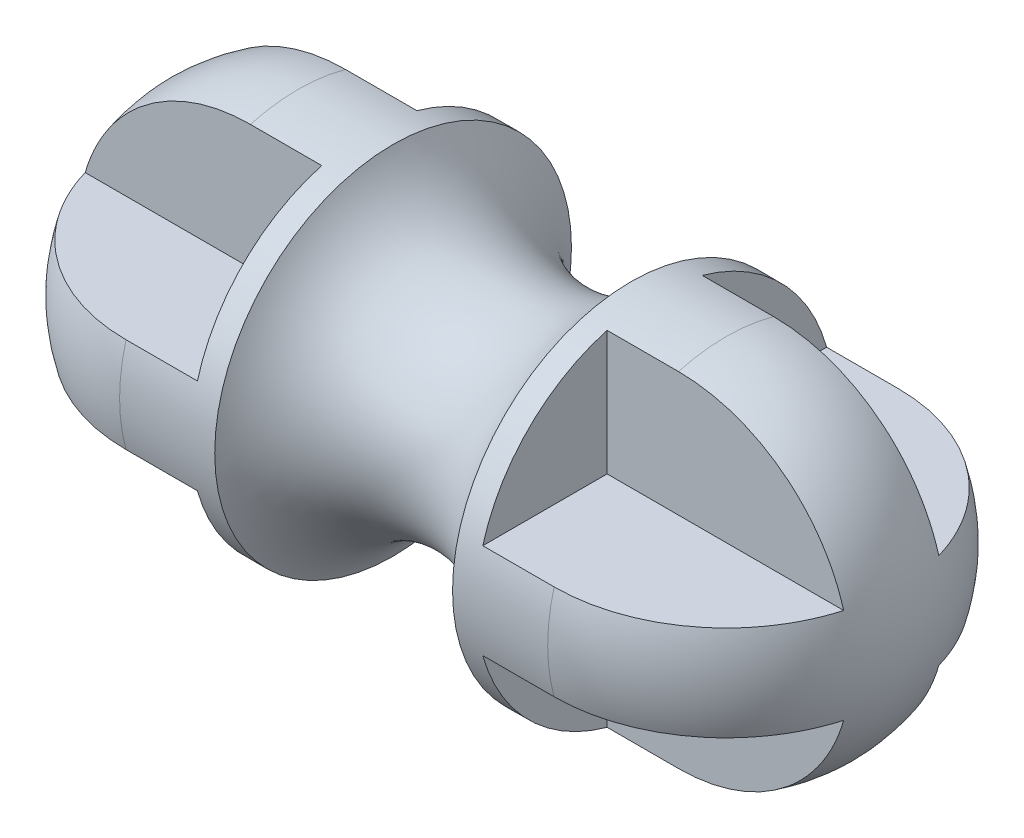
ISO-10303-21;
HEADER;
FILE_DESCRIPTION(('STEP AP214'),'2;1');
FILE_NAME('part.step','',(''),(''),'','','');
FILE_SCHEMA(('AUTOMOTIVE_DESIGN { 1 0 10303 214 1 1 1 1 }'));
ENDSEC;
DATA;
#1=APPLICATION_CONTEXT('core data for automotive mechanical design processes');
#2=APPLICATION_PROTOCOL_DEFINITION('international standard','automotive_design',2000,#1);
#3=PRODUCT_CONTEXT('',#1,'mechanical');
#4=PRODUCT('Part','Part','',(#3));
#5=PRODUCT_RELATED_PRODUCT_CATEGORY('part','',(#4));
#6=PRODUCT_DEFINITION_FORMATION('','',#4);
#7=PRODUCT_DEFINITION_CONTEXT('part definition',#1,'design');
#8=PRODUCT_DEFINITION('design','',#6,#7);
#9=PRODUCT_DEFINITION_SHAPE('','',#8);
#10=(LENGTH_UNIT() NAMED_UNIT(*) SI_UNIT(.MILLI.,.METRE.));
#11=(NAMED_UNIT(*) PLANE_ANGLE_UNIT() SI_UNIT($,.RADIAN.));
#12=(NAMED_UNIT(*) SI_UNIT($,.STERADIAN.) SOLID_ANGLE_UNIT());
#13=UNCERTAINTY_MEASURE_WITH_UNIT(LENGTH_MEASURE(1.E-05),#10,'distance_accuracy_value','');
#14=(GEOMETRIC_REPRESENTATION_CONTEXT(3) GLOBAL_UNCERTAINTY_ASSIGNED_CONTEXT((#13)) GLOBAL_UNIT_ASSIGNED_CONTEXT((#10,
#11,#12)) REPRESENTATION_CONTEXT('',''));
#15=CARTESIAN_POINT('',(0.,0.,0.));
#16=DIRECTION('',(0.,0.,1.));
#17=DIRECTION('',(1.,0.,0.));
#18=AXIS2_PLACEMENT_3D('',#15,#16,#17);
#19=CARTESIAN_POINT('',(-82.5,0.,0.));
#20=DIRECTION('',(-1.,0.,0.));
#21=DIRECTION('',(0.,-1.,0.));
#22=AXIS2_PLACEMENT_3D('',#19,#20,#21);
#23=CYLINDRICAL_SURFACE('',#22,37.5);
#24=CARTESIAN_POINT('',(25.,0.,0.));
#25=DIRECTION('',(-1.,0.,0.));
#26=DIRECTION('',(0.,-1.,0.));
#27=AXIS2_PLACEMENT_3D('',#24,#25,#26);
#28=CIRCLE('',#27,37.5);
#29=CARTESIAN_POINT('',(25.,-37.5,0.));
#30=VERTEX_POINT('',#29);
#31=EDGE_CURVE('E404',#30,#30,#28,.T.);
#32=ORIENTED_EDGE('',*,*,#31,.F.);
#33=EDGE_LOOP('',(#32));
#34=FACE_BOUND('',#33,.T.);
#35=DIRECTION('',(-1.,0.,0.));
#36=VECTOR('',#35,1.);
#37=CARTESIAN_POINT('',(82.5,-36.1420807370024,-10.));
#38=LINE('',#37,#36);
#39=CARTESIAN_POINT('',(45.,-36.1420807370024,-10.));
#40=VERTEX_POINT('',#39);
#41=CARTESIAN_POINT('',(30.,-36.1420807370024,-10.));
#42=VERTEX_POINT('',#41);
#43=EDGE_CURVE('E332',#40,#42,#38,.T.);
#44=ORIENTED_EDGE('',*,*,#43,.F.);
#45=CARTESIAN_POINT('',(45.,0.,0.));
#46=DIRECTION('',(-1.,0.,0.));
#47=DIRECTION('',(0.,-1.,0.));
#48=AXIS2_PLACEMENT_3D('',#45,#46,#47);
#49=CIRCLE('',#48,37.5);
#50=CARTESIAN_POINT('',(45.,-36.1420807370024,10.));
#51=VERTEX_POINT('',#50);
#52=EDGE_CURVE('E398',#40,#51,#49,.T.);
#53=ORIENTED_EDGE('',*,*,#52,.T.);
#54=DIRECTION('',(-1.,0.,0.));
#55=VECTOR('',#54,1.);
#56=CARTESIAN_POINT('',(82.5,-36.1420807370024,10.));
#57=LINE('',#56,#55);
#58=CARTESIAN_POINT('',(30.,-36.1420807370024,10.));
#59=VERTEX_POINT('',#58);
#60=EDGE_CURVE('E339',#51,#59,#57,.T.);
#61=ORIENTED_EDGE('',*,*,#60,.T.);
#62=CARTESIAN_POINT('',(30.,0.,0.));
#63=DIRECTION('',(1.,0.,0.));
#64=DIRECTION('',(0.,0.,-1.));
#65=AXIS2_PLACEMENT_3D('',#62,#63,#64);
#66=CIRCLE('',#65,37.5);
#67=CARTESIAN_POINT('',(30.,-10.,36.1420807370024));
#68=VERTEX_POINT('',#67);
#69=EDGE_CURVE('E336',#68,#59,#66,.T.);
#70=ORIENTED_EDGE('',*,*,#69,.F.);
#71=DIRECTION('',(-1.,0.,0.));
#72=VECTOR('',#71,1.);
#73=CARTESIAN_POINT('',(82.5,-10.,36.1420807370024));
#74=LINE('',#73,#72);
#75=CARTESIAN_POINT('',(45.,-10.,36.1420807370024));
#76=VERTEX_POINT('',#75);
#77=EDGE_CURVE('E343',#76,#68,#74,.T.);
#78=ORIENTED_EDGE('',*,*,#77,.F.);
#79=CARTESIAN_POINT('',(45.,10.,36.1420807370024));
#80=VERTEX_POINT('',#79);
#81=EDGE_CURVE('E403',#76,#80,#49,.T.);
#82=ORIENTED_EDGE('',*,*,#81,.T.);
#83=DIRECTION('',(-1.,0.,0.));
#84=VECTOR('',#83,1.);
#85=CARTESIAN_POINT('',(82.5,10.,36.1420807370024));
#86=LINE('',#85,#84);
#87=CARTESIAN_POINT('',(30.,10.,36.1420807370024));
#88=VERTEX_POINT('',#87);
#89=EDGE_CURVE('E319',#80,#88,#86,.T.);
#90=ORIENTED_EDGE('',*,*,#89,.T.);
#91=CARTESIAN_POINT('',(30.,0.,0.));
#92=DIRECTION('',(1.,0.,0.));
#93=DIRECTION('',(0.,0.,-1.));
#94=AXIS2_PLACEMENT_3D('',#91,#92,#93);
#95=CIRCLE('',#94,37.5);
#96=CARTESIAN_POINT('',(30.,36.1420807370024,10.));
#97=VERTEX_POINT('',#96);
#98=EDGE_CURVE('E308',#97,#88,#95,.T.);
#99=ORIENTED_EDGE('',*,*,#98,.F.);
#100=DIRECTION('',(-1.,0.,0.));
#101=VECTOR('',#100,1.);
#102=CARTESIAN_POINT('',(82.5,36.1420807370024,10.));
#103=LINE('',#102,#101);
#104=CARTESIAN_POINT('',(45.,36.1420807370024,10.));
#105=VERTEX_POINT('',#104);
#106=EDGE_CURVE('E323',#105,#97,#103,.T.);
#107=ORIENTED_EDGE('',*,*,#106,.F.);
#108=CARTESIAN_POINT('',(45.,36.1420807370024,-10.));
#109=VERTEX_POINT('',#108);
#110=EDGE_CURVE('E771',#105,#109,#49,.T.);
#111=ORIENTED_EDGE('',*,*,#110,.T.);
#112=DIRECTION('',(-1.,0.,0.));
#113=VECTOR('',#112,1.);
#114=CARTESIAN_POINT('',(82.5,36.1420807370024,-10.));
#115=LINE('',#114,#113);
#116=CARTESIAN_POINT('',(30.,36.1420807370024,-10.));
#117=VERTEX_POINT('',#116);
#118=EDGE_CURVE('E384',#109,#117,#115,.T.);
#119=ORIENTED_EDGE('',*,*,#118,.T.);
#120=CARTESIAN_POINT('',(30.,0.,0.));
#121=DIRECTION('',(1.,0.,0.));
#122=DIRECTION('',(0.,0.,-1.));
#123=AXIS2_PLACEMENT_3D('',#120,#121,#122);
#124=CIRCLE('',#123,37.5);
#125=CARTESIAN_POINT('',(30.,10.,-36.1420807370024));
#126=VERTEX_POINT('',#125);
#127=EDGE_CURVE('E326',#126,#117,#124,.T.);
#128=ORIENTED_EDGE('',*,*,#127,.F.);
#129=DIRECTION('',(-1.,0.,0.));
#130=VECTOR('',#129,1.);
#131=CARTESIAN_POINT('',(82.5,10.,-36.1420807370024));
#132=LINE('',#131,#130);
#133=CARTESIAN_POINT('',(45.,10.,-36.1420807370024));
#134=VERTEX_POINT('',#133);
#135=EDGE_CURVE('E378',#134,#126,#132,.T.);
#136=ORIENTED_EDGE('',*,*,#135,.F.);
#137=CARTESIAN_POINT('',(45.,-10.,-36.1420807370024));
#138=VERTEX_POINT('',#137);
#139=EDGE_CURVE('E402',#134,#138,#49,.T.);
#140=ORIENTED_EDGE('',*,*,#139,.T.);
#141=DIRECTION('',(-1.,0.,0.));
#142=VECTOR('',#141,1.);
#143=CARTESIAN_POINT('',(82.5,-10.,-36.1420807370024));
#144=LINE('',#143,#142);
#145=CARTESIAN_POINT('',(30.,-10.,-36.1420807370024));
#146=VERTEX_POINT('',#145);
#147=EDGE_CURVE('E361',#138,#146,#144,.T.);
#148=ORIENTED_EDGE('',*,*,#147,.T.);
#149=CARTESIAN_POINT('',(30.,0.,0.));
#150=DIRECTION('',(1.,0.,0.));
#151=DIRECTION('',(0.,0.,-1.));
#152=AXIS2_PLACEMENT_3D('',#149,#150,#151);
#153=CIRCLE('',#152,37.5);
#154=EDGE_CURVE('E351',#42,#146,#153,.T.);
#155=ORIENTED_EDGE('',*,*,#154,.F.);
#156=EDGE_LOOP('',(#44,#53,#61,#70,#78,#82,#90,#99,#107,#111,#119,#128,#136,#140,#148,#155));
#157=FACE_BOUND('',#156,.T.);
#158=ADVANCED_FACE('F41',(#34,#157),#23,.T.);
#159=CARTESIAN_POINT('',(45.,0.,0.));
#160=DIRECTION('',(-1.,0.,0.));
#161=DIRECTION('',(0.,-1.,0.));
#162=AXIS2_PLACEMENT_3D('',#159,#160,#161);
#163=SPHERICAL_SURFACE('',#162,37.5);
#164=CARTESIAN_POINT('',(45.,0.,-10.));
#165=DIRECTION('',(0.,0.,-1.));
#166=DIRECTION('',(0.,1.,0.));
#167=AXIS2_PLACEMENT_3D('',#164,#165,#166);
#168=CIRCLE('',#167,36.1420807370024);
#169=CARTESIAN_POINT('',(79.7311099736245,-10.,-10.));
#170=VERTEX_POINT('',#169);
#171=EDGE_CURVE('E431',#170,#40,#168,.T.);
#172=ORIENTED_EDGE('',*,*,#171,.F.);
#173=CARTESIAN_POINT('',(45.,-10.,0.));
#174=DIRECTION('',(0.,-1.,0.));
#175=DIRECTION('',(0.,0.,-1.));
#176=AXIS2_PLACEMENT_3D('',#173,#174,#175);
#177=CIRCLE('',#176,36.1420807370024);
#178=EDGE_CURVE('E428',#138,#170,#177,.T.);
#179=ORIENTED_EDGE('',*,*,#178,.F.);
#180=ORIENTED_EDGE('',*,*,#139,.F.);
#181=CARTESIAN_POINT('',(45.,10.,0.));
#182=DIRECTION('',(0.,1.,0.));
#183=DIRECTION('',(0.,0.,1.));
#184=AXIS2_PLACEMENT_3D('',#181,#182,#183);
#185=CIRCLE('',#184,36.1420807370024);
#186=CARTESIAN_POINT('',(79.7311099736245,10.,-10.));
#187=VERTEX_POINT('',#186);
#188=EDGE_CURVE('E408',#187,#134,#185,.T.);
#189=ORIENTED_EDGE('',*,*,#188,.F.);
#190=CARTESIAN_POINT('',(45.,0.,-10.));
#191=DIRECTION('',(0.,0.,-1.));
#192=DIRECTION('',(0.,1.,0.));
#193=AXIS2_PLACEMENT_3D('',#190,#191,#192);
#194=CIRCLE('',#193,36.1420807370024);
#195=EDGE_CURVE('E411',#109,#187,#194,.T.);
#196=ORIENTED_EDGE('',*,*,#195,.F.);
#197=ORIENTED_EDGE('',*,*,#110,.F.);
#198=CARTESIAN_POINT('',(45.,0.,10.));
#199=DIRECTION('',(0.,0.,1.));
#200=DIRECTION('',(0.,-1.,0.));
#201=AXIS2_PLACEMENT_3D('',#198,#199,#200);
#202=CIRCLE('',#201,36.1420807370024);
#203=CARTESIAN_POINT('',(79.7311099736245,10.,10.));
#204=VERTEX_POINT('',#203);
#205=EDGE_CURVE('E418',#204,#105,#202,.T.);
#206=ORIENTED_EDGE('',*,*,#205,.F.);
#207=CARTESIAN_POINT('',(45.,10.,0.));
#208=DIRECTION('',(0.,1.,0.));
#209=DIRECTION('',(0.,0.,1.));
#210=AXIS2_PLACEMENT_3D('',#207,#208,#209);
#211=CIRCLE('',#210,36.1420807370024);
#212=EDGE_CURVE('E415',#80,#204,#211,.T.);
#213=ORIENTED_EDGE('',*,*,#212,.F.);
#214=ORIENTED_EDGE('',*,*,#81,.F.);
#215=CARTESIAN_POINT('',(45.,-10.,0.));
#216=DIRECTION('',(0.,-1.,0.));
#217=DIRECTION('',(0.,0.,-1.));
#218=AXIS2_PLACEMENT_3D('',#215,#216,#217);
#219=CIRCLE('',#218,36.1420807370024);
#220=CARTESIAN_POINT('',(79.7311099736245,-10.,10.));
#221=VERTEX_POINT('',#220);
#222=EDGE_CURVE('E421',#221,#76,#219,.T.);
#223=ORIENTED_EDGE('',*,*,#222,.F.);
#224=CARTESIAN_POINT('',(45.,0.,10.));
#225=DIRECTION('',(0.,0.,1.));
#226=DIRECTION('',(0.,-1.,0.));
#227=AXIS2_PLACEMENT_3D('',#224,#225,#226);
#228=CIRCLE('',#227,36.1420807370024);
#229=EDGE_CURVE('E424',#51,#221,#228,.T.);
#230=ORIENTED_EDGE('',*,*,#229,.F.);
#231=ORIENTED_EDGE('',*,*,#52,.F.);
#232=EDGE_LOOP('',(#172,#179,#180,#189,#196,#197,#206,#213,#214,#223,#230,#231));
#233=FACE_BOUND('',#232,.T.);
#234=ADVANCED_FACE('F492',(#233),#163,.T.);
#235=CARTESIAN_POINT('',(0.,0.,0.));
#236=DIRECTION('',(-1.,0.,0.));
#237=DIRECTION('',(0.,-1.,0.));
#238=AXIS2_PLACEMENT_3D('',#235,#236,#237);
#239=TOROIDAL_SURFACE('',#238,50.8333333333333,28.3333333333333);
#240=CARTESIAN_POINT('',(-25.,0.,0.));
#241=DIRECTION('',(-1.,0.,0.));
#242=DIRECTION('',(0.,-1.,0.));
#243=AXIS2_PLACEMENT_3D('',#240,#241,#242);
#244=CIRCLE('',#243,37.5);
#245=CARTESIAN_POINT('',(-25.,-37.5,0.));
#246=VERTEX_POINT('',#245);
#247=EDGE_CURVE('E388',#246,#246,#244,.T.);
#248=ORIENTED_EDGE('',*,*,#247,.F.);
#249=EDGE_LOOP('',(#248));
#250=FACE_BOUND('',#249,.T.);
#251=ORIENTED_EDGE('',*,*,#31,.T.);
#252=EDGE_LOOP('',(#251));
#253=FACE_BOUND('',#252,.T.);
#254=ADVANCED_FACE('F43',(#250,#253),#239,.F.);
#255=CARTESIAN_POINT('',(-45.,0.,0.));
#256=DIRECTION('',(-1.,0.,0.));
#257=DIRECTION('',(0.,1.,0.));
#258=AXIS2_PLACEMENT_3D('',#255,#256,#257);
#259=SPHERICAL_SURFACE('',#258,37.5);
#260=CARTESIAN_POINT('',(-45.,-10.,0.));
#261=DIRECTION('',(0.,1.,0.));
#262=DIRECTION('',(0.,0.,1.));
#263=AXIS2_PLACEMENT_3D('',#260,#261,#262);
#264=CIRCLE('',#263,36.1420807370024);
#265=CARTESIAN_POINT('',(-45.,-10.,-36.1420807370024));
#266=VERTEX_POINT('',#265);
#267=CARTESIAN_POINT('',(-79.7311099736245,-10.,-10.));
#268=VERTEX_POINT('',#267);
#269=EDGE_CURVE('E295',#266,#268,#264,.T.);
#270=ORIENTED_EDGE('',*,*,#269,.T.);
#271=CARTESIAN_POINT('',(-45.,0.,-10.));
#272=DIRECTION('',(0.,0.,1.));
#273=DIRECTION('',(0.,-1.,0.));
#274=AXIS2_PLACEMENT_3D('',#271,#272,#273);
#275=CIRCLE('',#274,36.1420807370024);
#276=CARTESIAN_POINT('',(-45.,-36.1420807370024,-10.));
#277=VERTEX_POINT('',#276);
#278=EDGE_CURVE('E299',#268,#277,#275,.T.);
#279=ORIENTED_EDGE('',*,*,#278,.T.);
#280=CARTESIAN_POINT('',(-45.,0.,0.));
#281=DIRECTION('',(-1.,0.,0.));
#282=DIRECTION('',(0.,-1.,0.));
#283=AXIS2_PLACEMENT_3D('',#280,#281,#282);
#284=CIRCLE('',#283,37.5);
#285=CARTESIAN_POINT('',(-45.,-36.1420807370024,10.));
#286=VERTEX_POINT('',#285);
#287=EDGE_CURVE('E392',#277,#286,#284,.T.);
#288=ORIENTED_EDGE('',*,*,#287,.T.);
#289=CARTESIAN_POINT('',(-45.,0.,10.));
#290=DIRECTION('',(0.,0.,-1.));
#291=DIRECTION('',(0.,1.,0.));
#292=AXIS2_PLACEMENT_3D('',#289,#290,#291);
#293=CIRCLE('',#292,36.1420807370024);
#294=CARTESIAN_POINT('',(-79.7311099736245,-10.,10.));
#295=VERTEX_POINT('',#294);
#296=EDGE_CURVE('E291',#286,#295,#293,.T.);
#297=ORIENTED_EDGE('',*,*,#296,.T.);
#298=CARTESIAN_POINT('',(-45.,-10.,0.));
#299=DIRECTION('',(0.,1.,0.));
#300=DIRECTION('',(0.,0.,1.));
#301=AXIS2_PLACEMENT_3D('',#298,#299,#300);
#302=CIRCLE('',#301,36.1420807370024);
#303=CARTESIAN_POINT('',(-45.,-10.,36.1420807370024));
#304=VERTEX_POINT('',#303);
#305=EDGE_CURVE('E287',#295,#304,#302,.T.);
#306=ORIENTED_EDGE('',*,*,#305,.T.);
#307=CARTESIAN_POINT('',(-45.,10.,36.1420807370024));
#308=VERTEX_POINT('',#307);
#309=EDGE_CURVE('E397',#304,#308,#284,.T.);
#310=ORIENTED_EDGE('',*,*,#309,.T.);
#311=CARTESIAN_POINT('',(-45.,10.,0.));
#312=DIRECTION('',(0.,-1.,0.));
#313=DIRECTION('',(0.,0.,-1.));
#314=AXIS2_PLACEMENT_3D('',#311,#312,#313);
#315=CIRCLE('',#314,36.1420807370024);
#316=CARTESIAN_POINT('',(-79.7311099736245,10.,10.));
#317=VERTEX_POINT('',#316);
#318=EDGE_CURVE('E282',#308,#317,#315,.T.);
#319=ORIENTED_EDGE('',*,*,#318,.T.);
#320=CARTESIAN_POINT('',(-45.,0.,10.));
#321=DIRECTION('',(0.,0.,-1.));
#322=DIRECTION('',(0.,1.,0.));
#323=AXIS2_PLACEMENT_3D('',#320,#321,#322);
#324=CIRCLE('',#323,36.1420807370024);
#325=CARTESIAN_POINT('',(-45.,36.1420807370024,10.));
#326=VERTEX_POINT('',#325);
#327=EDGE_CURVE('E211',#317,#326,#324,.T.);
#328=ORIENTED_EDGE('',*,*,#327,.T.);
#329=CARTESIAN_POINT('',(-45.,36.1420807370024,-10.));
#330=VERTEX_POINT('',#329);
#331=EDGE_CURVE('E466',#326,#330,#284,.T.);
#332=ORIENTED_EDGE('',*,*,#331,.T.);
#333=CARTESIAN_POINT('',(-45.,0.,-10.));
#334=DIRECTION('',(0.,0.,1.));
#335=DIRECTION('',(0.,-1.,0.));
#336=AXIS2_PLACEMENT_3D('',#333,#334,#335);
#337=CIRCLE('',#336,36.1420807370024);
#338=CARTESIAN_POINT('',(-79.7311099736245,10.,-10.));
#339=VERTEX_POINT('',#338);
#340=EDGE_CURVE('E274',#330,#339,#337,.T.);
#341=ORIENTED_EDGE('',*,*,#340,.T.);
#342=CARTESIAN_POINT('',(-45.,10.,0.));
#343=DIRECTION('',(0.,-1.,0.));
#344=DIRECTION('',(0.,0.,-1.));
#345=AXIS2_PLACEMENT_3D('',#342,#343,#344);
#346=CIRCLE('',#345,36.1420807370024);
#347=CARTESIAN_POINT('',(-45.,10.,-36.1420807370024));
#348=VERTEX_POINT('',#347);
#349=EDGE_CURVE('E278',#339,#348,#346,.T.);
#350=ORIENTED_EDGE('',*,*,#349,.T.);
#351=EDGE_CURVE('E396',#348,#266,#284,.T.);
#352=ORIENTED_EDGE('',*,*,#351,.T.);
#353=EDGE_LOOP('',(#270,#279,#288,#297,#306,#310,#319,#328,#332,#341,#350,#352));
#354=FACE_BOUND('',#353,.T.);
#355=ADVANCED_FACE('F464',(#354),#259,.T.);
#356=CARTESIAN_POINT('',(-82.5,0.,0.));
#357=DIRECTION('',(-1.,0.,0.));
#358=DIRECTION('',(0.,-1.,0.));
#359=AXIS2_PLACEMENT_3D('',#356,#357,#358);
#360=CYLINDRICAL_SURFACE('',#359,37.5);
#361=ORIENTED_EDGE('',*,*,#287,.F.);
#362=DIRECTION('',(-1.,0.,0.));
#363=VECTOR('',#362,1.);
#364=CARTESIAN_POINT('',(-82.5,-36.1420807370024,-10.));
#365=LINE('',#364,#363);
#366=CARTESIAN_POINT('',(-30.,-36.1420807370024,-10.));
#367=VERTEX_POINT('',#366);
#368=EDGE_CURVE('E11',#277,#367,#365,.F.);
#369=ORIENTED_EDGE('',*,*,#368,.T.);
#370=CARTESIAN_POINT('',(-30.,0.,0.));
#371=DIRECTION('',(1.,0.,0.));
#372=DIRECTION('',(0.,0.,-1.));
#373=AXIS2_PLACEMENT_3D('',#370,#371,#372);
#374=CIRCLE('',#373,37.5);
#375=CARTESIAN_POINT('',(-30.,-10.,-36.1420807370024));
#376=VERTEX_POINT('',#375);
#377=EDGE_CURVE('E254',#367,#376,#374,.T.);
#378=ORIENTED_EDGE('',*,*,#377,.T.);
#379=DIRECTION('',(-1.,0.,0.));
#380=VECTOR('',#379,1.);
#381=CARTESIAN_POINT('',(-82.5,-10.,-36.1420807370024));
#382=LINE('',#381,#380);
#383=EDGE_CURVE('E50',#376,#266,#382,.T.);
#384=ORIENTED_EDGE('',*,*,#383,.T.);
#385=ORIENTED_EDGE('',*,*,#351,.F.);
#386=DIRECTION('',(-1.,0.,0.));
#387=VECTOR('',#386,1.);
#388=CARTESIAN_POINT('',(-82.5,10.,-36.1420807370024));
#389=LINE('',#388,#387);
#390=CARTESIAN_POINT('',(-30.,10.,-36.1420807370024));
#391=VERTEX_POINT('',#390);
#392=EDGE_CURVE('E438',#348,#391,#389,.F.);
#393=ORIENTED_EDGE('',*,*,#392,.T.);
#394=CARTESIAN_POINT('',(-30.,0.,0.));
#395=DIRECTION('',(1.,0.,0.));
#396=DIRECTION('',(0.,0.,-1.));
#397=AXIS2_PLACEMENT_3D('',#394,#395,#396);
#398=CIRCLE('',#397,37.5);
#399=CARTESIAN_POINT('',(-30.,36.1420807370024,-10.));
#400=VERTEX_POINT('',#399);
#401=EDGE_CURVE('E216',#391,#400,#398,.T.);
#402=ORIENTED_EDGE('',*,*,#401,.T.);
#403=DIRECTION('',(-1.,0.,0.));
#404=VECTOR('',#403,1.);
#405=CARTESIAN_POINT('',(-82.5,36.1420807370024,-10.));
#406=LINE('',#405,#404);
#407=EDGE_CURVE('E434',#400,#330,#406,.T.);
#408=ORIENTED_EDGE('',*,*,#407,.T.);
#409=ORIENTED_EDGE('',*,*,#331,.F.);
#410=DIRECTION('',(-1.,0.,0.));
#411=VECTOR('',#410,1.);
#412=CARTESIAN_POINT('',(-82.5,36.1420807370024,10.));
#413=LINE('',#412,#411);
#414=CARTESIAN_POINT('',(-30.,36.1420807370024,10.));
#415=VERTEX_POINT('',#414);
#416=EDGE_CURVE('E444',#326,#415,#413,.F.);
#417=ORIENTED_EDGE('',*,*,#416,.T.);
#418=CARTESIAN_POINT('',(-30.,0.,0.));
#419=DIRECTION('',(1.,0.,0.));
#420=DIRECTION('',(0.,0.,-1.));
#421=AXIS2_PLACEMENT_3D('',#418,#419,#420);
#422=CIRCLE('',#421,37.5);
#423=CARTESIAN_POINT('',(-30.,10.,36.1420807370024));
#424=VERTEX_POINT('',#423);
#425=EDGE_CURVE('E217',#415,#424,#422,.T.);
#426=ORIENTED_EDGE('',*,*,#425,.T.);
#427=DIRECTION('',(-1.,0.,0.));
#428=VECTOR('',#427,1.);
#429=CARTESIAN_POINT('',(-82.5,10.,36.1420807370024));
#430=LINE('',#429,#428);
#431=EDGE_CURVE('E230',#424,#308,#430,.T.);
#432=ORIENTED_EDGE('',*,*,#431,.T.);
#433=ORIENTED_EDGE('',*,*,#309,.F.);
#434=DIRECTION('',(-1.,0.,0.));
#435=VECTOR('',#434,1.);
#436=CARTESIAN_POINT('',(-82.5,-10.,36.1420807370024));
#437=LINE('',#436,#435);
#438=CARTESIAN_POINT('',(-30.,-10.,36.1420807370024));
#439=VERTEX_POINT('',#438);
#440=EDGE_CURVE('E447',#304,#439,#437,.F.);
#441=ORIENTED_EDGE('',*,*,#440,.T.);
#442=CARTESIAN_POINT('',(-30.,0.,0.));
#443=DIRECTION('',(1.,0.,0.));
#444=DIRECTION('',(0.,0.,-1.));
#445=AXIS2_PLACEMENT_3D('',#442,#443,#444);
#446=CIRCLE('',#445,37.5);
#447=CARTESIAN_POINT('',(-30.,-36.1420807370024,10.));
#448=VERTEX_POINT('',#447);
#449=EDGE_CURVE('E238',#439,#448,#446,.T.);
#450=ORIENTED_EDGE('',*,*,#449,.T.);
#451=DIRECTION('',(-1.,0.,0.));
#452=VECTOR('',#451,1.);
#453=CARTESIAN_POINT('',(-82.5,-36.1420807370024,10.));
#454=LINE('',#453,#452);
#455=EDGE_CURVE('E451',#448,#286,#454,.T.);
#456=ORIENTED_EDGE('',*,*,#455,.T.);
#457=EDGE_LOOP('',(#361,#369,#378,#384,#385,#393,#402,#408,#409,#417,#426,#432,#433,#441,#450,#456));
#458=FACE_BOUND('',#457,.T.);
#459=ORIENTED_EDGE('',*,*,#247,.T.);
#460=EDGE_LOOP('',(#459));
#461=FACE_BOUND('',#460,.T.);
#462=ADVANCED_FACE('F460',(#458,#461),#360,.T.);
#463=CARTESIAN_POINT('',(82.5,36.1420807370024,-10.));
#464=DIRECTION('',(0.,0.,-1.));
#465=DIRECTION('',(0.,1.,0.));
#466=AXIS2_PLACEMENT_3D('',#463,#464,#465);
#467=PLANE('',#466);
#468=ORIENTED_EDGE('',*,*,#195,.T.);
#469=DIRECTION('',(-1.,0.,0.));
#470=VECTOR('',#469,1.);
#471=CARTESIAN_POINT('',(82.5,10.,-10.));
#472=LINE('',#471,#470);
#473=CARTESIAN_POINT('',(30.,10.,-10.));
#474=VERTEX_POINT('',#473);
#475=EDGE_CURVE('E381',#187,#474,#472,.T.);
#476=ORIENTED_EDGE('',*,*,#475,.T.);
#477=DIRECTION('',(0.,-1.,0.));
#478=VECTOR('',#477,1.);
#479=CARTESIAN_POINT('',(30.,36.1420807370024,-10.));
#480=LINE('',#479,#478);
#481=EDGE_CURVE('E370',#117,#474,#480,.T.);
#482=ORIENTED_EDGE('',*,*,#481,.F.);
#483=ORIENTED_EDGE('',*,*,#118,.F.);
#484=EDGE_LOOP('',(#468,#476,#482,#483));
#485=FACE_BOUND('',#484,.T.);
#486=ADVANCED_FACE('F506',(#485),#467,.T.);
#487=CARTESIAN_POINT('',(82.5,10.,-10.));
#488=DIRECTION('',(0.,1.,0.));
#489=DIRECTION('',(0.,0.,1.));
#490=AXIS2_PLACEMENT_3D('',#487,#488,#489);
#491=PLANE('',#490);
#492=ORIENTED_EDGE('',*,*,#188,.T.);
#493=ORIENTED_EDGE('',*,*,#135,.T.);
#494=DIRECTION('',(0.,0.,-1.));
#495=VECTOR('',#494,1.);
#496=CARTESIAN_POINT('',(30.,10.,-10.));
#497=LINE('',#496,#495);
#498=EDGE_CURVE('E374',#474,#126,#497,.T.);
#499=ORIENTED_EDGE('',*,*,#498,.F.);
#500=ORIENTED_EDGE('',*,*,#475,.F.);
#501=EDGE_LOOP('',(#492,#493,#499,#500));
#502=FACE_BOUND('',#501,.T.);
#503=ADVANCED_FACE('F509',(#502),#491,.T.);
#504=CARTESIAN_POINT('',(30.,0.,0.));
#505=DIRECTION('',(1.,0.,0.));
#506=DIRECTION('',(0.,0.,-1.));
#507=AXIS2_PLACEMENT_3D('',#504,#505,#506);
#508=PLANE('',#507);
#509=ORIENTED_EDGE('',*,*,#127,.T.);
#510=ORIENTED_EDGE('',*,*,#481,.T.);
#511=ORIENTED_EDGE('',*,*,#498,.T.);
#512=EDGE_LOOP('',(#509,#510,#511));
#513=FACE_BOUND('',#512,.T.);
#514=ADVANCED_FACE('F513',(#513),#508,.T.);
#515=CARTESIAN_POINT('',(82.5,36.1420807370024,10.));
#516=DIRECTION('',(0.,0.,1.));
#517=DIRECTION('',(0.,-1.,0.));
#518=AXIS2_PLACEMENT_3D('',#515,#516,#517);
#519=PLANE('',#518);
#520=ORIENTED_EDGE('',*,*,#205,.T.);
#521=ORIENTED_EDGE('',*,*,#106,.T.);
#522=DIRECTION('',(0.,1.,0.));
#523=VECTOR('',#522,1.);
#524=CARTESIAN_POINT('',(30.,36.1420807370024,10.));
#525=LINE('',#524,#523);
#526=CARTESIAN_POINT('',(30.,10.,10.));
#527=VERTEX_POINT('',#526);
#528=EDGE_CURVE('E304',#527,#97,#525,.T.);
#529=ORIENTED_EDGE('',*,*,#528,.F.);
#530=DIRECTION('',(-1.,0.,0.));
#531=VECTOR('',#530,1.);
#532=CARTESIAN_POINT('',(82.5,10.,10.));
#533=LINE('',#532,#531);
#534=EDGE_CURVE('E316',#204,#527,#533,.T.);
#535=ORIENTED_EDGE('',*,*,#534,.F.);
#536=EDGE_LOOP('',(#520,#521,#529,#535));
#537=FACE_BOUND('',#536,.T.);
#538=ADVANCED_FACE('F517',(#537),#519,.T.);
#539=CARTESIAN_POINT('',(82.5,10.,10.));
#540=DIRECTION('',(0.,1.,0.));
#541=DIRECTION('',(0.,0.,1.));
#542=AXIS2_PLACEMENT_3D('',#539,#540,#541);
#543=PLANE('',#542);
#544=ORIENTED_EDGE('',*,*,#212,.T.);
#545=ORIENTED_EDGE('',*,*,#534,.T.);
#546=DIRECTION('',(0.,0.,-1.));
#547=VECTOR('',#546,1.);
#548=CARTESIAN_POINT('',(30.,10.,10.));
#549=LINE('',#548,#547);
#550=EDGE_CURVE('E312',#88,#527,#549,.T.);
#551=ORIENTED_EDGE('',*,*,#550,.F.);
#552=ORIENTED_EDGE('',*,*,#89,.F.);
#553=EDGE_LOOP('',(#544,#545,#551,#552));
#554=FACE_BOUND('',#553,.T.);
#555=ADVANCED_FACE('F546',(#554),#543,.T.);
#556=CARTESIAN_POINT('',(30.,0.,0.));
#557=DIRECTION('',(1.,0.,0.));
#558=DIRECTION('',(0.,0.,-1.));
#559=AXIS2_PLACEMENT_3D('',#556,#557,#558);
#560=PLANE('',#559);
#561=ORIENTED_EDGE('',*,*,#528,.T.);
#562=ORIENTED_EDGE('',*,*,#98,.T.);
#563=ORIENTED_EDGE('',*,*,#550,.T.);
#564=EDGE_LOOP('',(#561,#562,#563));
#565=FACE_BOUND('',#564,.T.);
#566=ADVANCED_FACE('F536',(#565),#560,.T.);
#567=CARTESIAN_POINT('',(82.5,-36.1420807370024,10.));
#568=DIRECTION('',(0.,0.,1.));
#569=DIRECTION('',(0.,-1.,0.));
#570=AXIS2_PLACEMENT_3D('',#567,#568,#569);
#571=PLANE('',#570);
#572=ORIENTED_EDGE('',*,*,#229,.T.);
#573=DIRECTION('',(-1.,0.,0.));
#574=VECTOR('',#573,1.);
#575=CARTESIAN_POINT('',(82.5,-10.,10.));
#576=LINE('',#575,#574);
#577=CARTESIAN_POINT('',(30.,-10.,10.));
#578=VERTEX_POINT('',#577);
#579=EDGE_CURVE('E309',#221,#578,#576,.T.);
#580=ORIENTED_EDGE('',*,*,#579,.T.);
#581=DIRECTION('',(0.,1.,0.));
#582=VECTOR('',#581,1.);
#583=CARTESIAN_POINT('',(30.,-36.1420807370024,10.));
#584=LINE('',#583,#582);
#585=EDGE_CURVE('E327',#59,#578,#584,.T.);
#586=ORIENTED_EDGE('',*,*,#585,.F.);
#587=ORIENTED_EDGE('',*,*,#60,.F.);
#588=EDGE_LOOP('',(#572,#580,#586,#587));
#589=FACE_BOUND('',#588,.T.);
#590=ADVANCED_FACE('F532',(#589),#571,.T.);
#591=CARTESIAN_POINT('',(82.5,-10.,10.));
#592=DIRECTION('',(0.,-1.,0.));
#593=DIRECTION('',(0.,0.,-1.));
#594=AXIS2_PLACEMENT_3D('',#591,#592,#593);
#595=PLANE('',#594);
#596=ORIENTED_EDGE('',*,*,#222,.T.);
#597=ORIENTED_EDGE('',*,*,#77,.T.);
#598=DIRECTION('',(0.,0.,1.));
#599=VECTOR('',#598,1.);
#600=CARTESIAN_POINT('',(30.,-10.,10.));
#601=LINE('',#600,#599);
#602=EDGE_CURVE('E331',#578,#68,#601,.T.);
#603=ORIENTED_EDGE('',*,*,#602,.F.);
#604=ORIENTED_EDGE('',*,*,#579,.F.);
#605=EDGE_LOOP('',(#596,#597,#603,#604));
#606=FACE_BOUND('',#605,.T.);
#607=ADVANCED_FACE('F535',(#606),#595,.T.);
#608=CARTESIAN_POINT('',(30.,0.,0.));
#609=DIRECTION('',(1.,0.,0.));
#610=DIRECTION('',(0.,0.,-1.));
#611=AXIS2_PLACEMENT_3D('',#608,#609,#610);
#612=PLANE('',#611);
#613=ORIENTED_EDGE('',*,*,#585,.T.);
#614=ORIENTED_EDGE('',*,*,#602,.T.);
#615=ORIENTED_EDGE('',*,*,#69,.T.);
#616=EDGE_LOOP('',(#613,#614,#615));
#617=FACE_BOUND('',#616,.T.);
#618=ADVANCED_FACE('F523',(#617),#612,.T.);
#619=CARTESIAN_POINT('',(82.5,-36.1420807370024,-10.));
#620=DIRECTION('',(0.,0.,-1.));
#621=DIRECTION('',(0.,1.,0.));
#622=AXIS2_PLACEMENT_3D('',#619,#620,#621);
#623=PLANE('',#622);
#624=ORIENTED_EDGE('',*,*,#171,.T.);
#625=ORIENTED_EDGE('',*,*,#43,.T.);
#626=DIRECTION('',(0.,-1.,0.));
#627=VECTOR('',#626,1.);
#628=CARTESIAN_POINT('',(30.,-36.1420807370024,-10.));
#629=LINE('',#628,#627);
#630=CARTESIAN_POINT('',(30.,-10.,-10.));
#631=VERTEX_POINT('',#630);
#632=EDGE_CURVE('E303',#631,#42,#629,.T.);
#633=ORIENTED_EDGE('',*,*,#632,.F.);
#634=DIRECTION('',(-1.,0.,0.));
#635=VECTOR('',#634,1.);
#636=CARTESIAN_POINT('',(82.5,-10.,-10.));
#637=LINE('',#636,#635);
#638=EDGE_CURVE('E358',#170,#631,#637,.T.);
#639=ORIENTED_EDGE('',*,*,#638,.F.);
#640=EDGE_LOOP('',(#624,#625,#633,#639));
#641=FACE_BOUND('',#640,.T.);
#642=ADVANCED_FACE('F519',(#641),#623,.T.);
#643=CARTESIAN_POINT('',(82.5,-10.,-10.));
#644=DIRECTION('',(0.,-1.,0.));
#645=DIRECTION('',(0.,0.,-1.));
#646=AXIS2_PLACEMENT_3D('',#643,#644,#645);
#647=PLANE('',#646);
#648=ORIENTED_EDGE('',*,*,#178,.T.);
#649=ORIENTED_EDGE('',*,*,#638,.T.);
#650=DIRECTION('',(0.,0.,1.));
#651=VECTOR('',#650,1.);
#652=CARTESIAN_POINT('',(30.,-10.,-10.));
#653=LINE('',#652,#651);
#654=EDGE_CURVE('E354',#146,#631,#653,.T.);
#655=ORIENTED_EDGE('',*,*,#654,.F.);
#656=ORIENTED_EDGE('',*,*,#147,.F.);
#657=EDGE_LOOP('',(#648,#649,#655,#656));
#658=FACE_BOUND('',#657,.T.);
#659=ADVANCED_FACE('F522',(#658),#647,.T.);
#660=CARTESIAN_POINT('',(30.,0.,0.));
#661=DIRECTION('',(1.,0.,0.));
#662=DIRECTION('',(0.,0.,-1.));
#663=AXIS2_PLACEMENT_3D('',#660,#661,#662);
#664=PLANE('',#663);
#665=ORIENTED_EDGE('',*,*,#632,.T.);
#666=ORIENTED_EDGE('',*,*,#154,.T.);
#667=ORIENTED_EDGE('',*,*,#654,.T.);
#668=EDGE_LOOP('',(#665,#666,#667));
#669=FACE_BOUND('',#668,.T.);
#670=ADVANCED_FACE('F527',(#669),#664,.T.);
#671=CARTESIAN_POINT('',(-82.5,10.,-10.));
#672=DIRECTION('',(0.,-1.,0.));
#673=DIRECTION('',(0.,0.,-1.));
#674=AXIS2_PLACEMENT_3D('',#671,#672,#673);
#675=PLANE('',#674);
#676=DIRECTION('',(1.,0.,0.));
#677=VECTOR('',#676,1.);
#678=CARTESIAN_POINT('',(-82.5,10.,-10.));
#679=LINE('',#678,#677);
#680=CARTESIAN_POINT('',(-30.,10.,-10.));
#681=VERTEX_POINT('',#680);
#682=EDGE_CURVE('E271',#339,#681,#679,.T.);
#683=ORIENTED_EDGE('',*,*,#682,.T.);
#684=DIRECTION('',(0.,0.,-1.));
#685=VECTOR('',#684,1.);
#686=CARTESIAN_POINT('',(-30.,10.,-10.));
#687=LINE('',#686,#685);
#688=EDGE_CURVE('E263',#681,#391,#687,.T.);
#689=ORIENTED_EDGE('',*,*,#688,.T.);
#690=ORIENTED_EDGE('',*,*,#392,.F.);
#691=ORIENTED_EDGE('',*,*,#349,.F.);
#692=EDGE_LOOP('',(#683,#689,#690,#691));
#693=FACE_BOUND('',#692,.T.);
#694=ADVANCED_FACE('F479',(#693),#675,.F.);
#695=CARTESIAN_POINT('',(-82.5,36.1420807370024,-10.));
#696=DIRECTION('',(0.,0.,1.));
#697=DIRECTION('',(0.,-1.,0.));
#698=AXIS2_PLACEMENT_3D('',#695,#696,#697);
#699=PLANE('',#698);
#700=ORIENTED_EDGE('',*,*,#407,.F.);
#701=DIRECTION('',(0.,-1.,0.));
#702=VECTOR('',#701,1.);
#703=CARTESIAN_POINT('',(-30.,36.1420807370024,-10.));
#704=LINE('',#703,#702);
#705=EDGE_CURVE('E267',#400,#681,#704,.T.);
#706=ORIENTED_EDGE('',*,*,#705,.T.);
#707=ORIENTED_EDGE('',*,*,#682,.F.);
#708=ORIENTED_EDGE('',*,*,#340,.F.);
#709=EDGE_LOOP('',(#700,#706,#707,#708));
#710=FACE_BOUND('',#709,.T.);
#711=ADVANCED_FACE('F475',(#710),#699,.F.);
#712=CARTESIAN_POINT('',(-30.,0.,0.));
#713=DIRECTION('',(-1.,0.,0.));
#714=DIRECTION('',(0.,0.,-1.));
#715=AXIS2_PLACEMENT_3D('',#712,#713,#714);
#716=PLANE('',#715);
#717=ORIENTED_EDGE('',*,*,#401,.F.);
#718=ORIENTED_EDGE('',*,*,#688,.F.);
#719=ORIENTED_EDGE('',*,*,#705,.F.);
#720=EDGE_LOOP('',(#717,#718,#719));
#721=FACE_BOUND('',#720,.T.);
#722=ADVANCED_FACE('F481',(#721),#716,.T.);
#723=CARTESIAN_POINT('',(-82.5,36.1420807370024,10.));
#724=DIRECTION('',(0.,0.,-1.));
#725=DIRECTION('',(0.,1.,0.));
#726=AXIS2_PLACEMENT_3D('',#723,#724,#725);
#727=PLANE('',#726);
#728=DIRECTION('',(1.,0.,0.));
#729=VECTOR('',#728,1.);
#730=CARTESIAN_POINT('',(-82.5,10.,10.));
#731=LINE('',#730,#729);
#732=CARTESIAN_POINT('',(-30.,10.,10.));
#733=VERTEX_POINT('',#732);
#734=EDGE_CURVE('E205',#317,#733,#731,.T.);
#735=ORIENTED_EDGE('',*,*,#734,.T.);
#736=DIRECTION('',(0.,1.,0.));
#737=VECTOR('',#736,1.);
#738=CARTESIAN_POINT('',(-30.,36.1420807370024,10.));
#739=LINE('',#738,#737);
#740=EDGE_CURVE('E208',#733,#415,#739,.T.);
#741=ORIENTED_EDGE('',*,*,#740,.T.);
#742=ORIENTED_EDGE('',*,*,#416,.F.);
#743=ORIENTED_EDGE('',*,*,#327,.F.);
#744=EDGE_LOOP('',(#735,#741,#742,#743));
#745=FACE_BOUND('',#744,.T.);
#746=ADVANCED_FACE('F207',(#745),#727,.F.);
#747=CARTESIAN_POINT('',(-82.5,10.,10.));
#748=DIRECTION('',(0.,-1.,0.));
#749=DIRECTION('',(0.,0.,-1.));
#750=AXIS2_PLACEMENT_3D('',#747,#748,#749);
#751=PLANE('',#750);
#752=ORIENTED_EDGE('',*,*,#431,.F.);
#753=DIRECTION('',(0.,0.,-1.));
#754=VECTOR('',#753,1.);
#755=CARTESIAN_POINT('',(-30.,10.,10.));
#756=LINE('',#755,#754);
#757=EDGE_CURVE('E221',#424,#733,#756,.T.);
#758=ORIENTED_EDGE('',*,*,#757,.T.);
#759=ORIENTED_EDGE('',*,*,#734,.F.);
#760=ORIENTED_EDGE('',*,*,#318,.F.);
#761=EDGE_LOOP('',(#752,#758,#759,#760));
#762=FACE_BOUND('',#761,.T.);
#763=ADVANCED_FACE('F228',(#762),#751,.F.);
#764=CARTESIAN_POINT('',(-30.,0.,0.));
#765=DIRECTION('',(-1.,0.,0.));
#766=DIRECTION('',(0.,0.,-1.));
#767=AXIS2_PLACEMENT_3D('',#764,#765,#766);
#768=PLANE('',#767);
#769=ORIENTED_EDGE('',*,*,#740,.F.);
#770=ORIENTED_EDGE('',*,*,#757,.F.);
#771=ORIENTED_EDGE('',*,*,#425,.F.);
#772=EDGE_LOOP('',(#769,#770,#771));
#773=FACE_BOUND('',#772,.T.);
#774=ADVANCED_FACE('F220',(#773),#768,.T.);
#775=CARTESIAN_POINT('',(-82.5,-36.1420807370024,10.));
#776=DIRECTION('',(0.,0.,-1.));
#777=DIRECTION('',(0.,1.,0.));
#778=AXIS2_PLACEMENT_3D('',#775,#776,#777);
#779=PLANE('',#778);
#780=ORIENTED_EDGE('',*,*,#455,.F.);
#781=DIRECTION('',(0.,1.,0.));
#782=VECTOR('',#781,1.);
#783=CARTESIAN_POINT('',(-30.,-36.1420807370024,10.));
#784=LINE('',#783,#782);
#785=CARTESIAN_POINT('',(-30.,-10.,10.));
#786=VERTEX_POINT('',#785);
#787=EDGE_CURVE('E65',#448,#786,#784,.T.);
#788=ORIENTED_EDGE('',*,*,#787,.T.);
#789=DIRECTION('',(1.,0.,0.));
#790=VECTOR('',#789,1.);
#791=CARTESIAN_POINT('',(-82.5,-10.,10.));
#792=LINE('',#791,#790);
#793=EDGE_CURVE('E226',#295,#786,#792,.T.);
#794=ORIENTED_EDGE('',*,*,#793,.F.);
#795=ORIENTED_EDGE('',*,*,#296,.F.);
#796=EDGE_LOOP('',(#780,#788,#794,#795));
#797=FACE_BOUND('',#796,.T.);
#798=ADVANCED_FACE('F591',(#797),#779,.F.);
#799=CARTESIAN_POINT('',(-82.5,-10.,10.));
#800=DIRECTION('',(0.,1.,0.));
#801=DIRECTION('',(0.,0.,1.));
#802=AXIS2_PLACEMENT_3D('',#799,#800,#801);
#803=PLANE('',#802);
#804=ORIENTED_EDGE('',*,*,#793,.T.);
#805=DIRECTION('',(0.,0.,1.));
#806=VECTOR('',#805,1.);
#807=CARTESIAN_POINT('',(-30.,-10.,10.));
#808=LINE('',#807,#806);
#809=EDGE_CURVE('E243',#786,#439,#808,.T.);
#810=ORIENTED_EDGE('',*,*,#809,.T.);
#811=ORIENTED_EDGE('',*,*,#440,.F.);
#812=ORIENTED_EDGE('',*,*,#305,.F.);
#813=EDGE_LOOP('',(#804,#810,#811,#812));
#814=FACE_BOUND('',#813,.T.);
#815=ADVANCED_FACE('F600',(#814),#803,.F.);
#816=CARTESIAN_POINT('',(-30.,0.,0.));
#817=DIRECTION('',(-1.,0.,0.));
#818=DIRECTION('',(0.,0.,-1.));
#819=AXIS2_PLACEMENT_3D('',#816,#817,#818);
#820=PLANE('',#819);
#821=ORIENTED_EDGE('',*,*,#787,.F.);
#822=ORIENTED_EDGE('',*,*,#449,.F.);
#823=ORIENTED_EDGE('',*,*,#809,.F.);
#824=EDGE_LOOP('',(#821,#822,#823));
#825=FACE_BOUND('',#824,.T.);
#826=ADVANCED_FACE('F610',(#825),#820,.T.);
#827=CARTESIAN_POINT('',(-82.5,-36.1420807370024,-10.));
#828=DIRECTION('',(0.,0.,1.));
#829=DIRECTION('',(0.,-1.,0.));
#830=AXIS2_PLACEMENT_3D('',#827,#828,#829);
#831=PLANE('',#830);
#832=DIRECTION('',(1.,0.,0.));
#833=VECTOR('',#832,1.);
#834=CARTESIAN_POINT('',(-82.5,-10.,-10.));
#835=LINE('',#834,#833);
#836=CARTESIAN_POINT('',(-30.,-10.,-10.));
#837=VERTEX_POINT('',#836);
#838=EDGE_CURVE('E239',#268,#837,#835,.T.);
#839=ORIENTED_EDGE('',*,*,#838,.T.);
#840=DIRECTION('',(0.,-1.,0.));
#841=VECTOR('',#840,1.);
#842=CARTESIAN_POINT('',(-30.,-36.1420807370024,-10.));
#843=LINE('',#842,#841);
#844=EDGE_CURVE('E249',#837,#367,#843,.T.);
#845=ORIENTED_EDGE('',*,*,#844,.T.);
#846=ORIENTED_EDGE('',*,*,#368,.F.);
#847=ORIENTED_EDGE('',*,*,#278,.F.);
#848=EDGE_LOOP('',(#839,#845,#846,#847));
#849=FACE_BOUND('',#848,.T.);
#850=ADVANCED_FACE('F620',(#849),#831,.F.);
#851=CARTESIAN_POINT('',(-82.5,-10.,-10.));
#852=DIRECTION('',(0.,1.,0.));
#853=DIRECTION('',(0.,0.,1.));
#854=AXIS2_PLACEMENT_3D('',#851,#852,#853);
#855=PLANE('',#854);
#856=ORIENTED_EDGE('',*,*,#383,.F.);
#857=DIRECTION('',(0.,0.,1.));
#858=VECTOR('',#857,1.);
#859=CARTESIAN_POINT('',(-30.,-10.,-10.));
#860=LINE('',#859,#858);
#861=EDGE_CURVE('E57',#376,#837,#860,.T.);
#862=ORIENTED_EDGE('',*,*,#861,.T.);
#863=ORIENTED_EDGE('',*,*,#838,.F.);
#864=ORIENTED_EDGE('',*,*,#269,.F.);
#865=EDGE_LOOP('',(#856,#862,#863,#864));
#866=FACE_BOUND('',#865,.T.);
#867=ADVANCED_FACE('F629',(#866),#855,.F.);
#868=CARTESIAN_POINT('',(-30.,0.,0.));
#869=DIRECTION('',(-1.,0.,0.));
#870=DIRECTION('',(0.,0.,-1.));
#871=AXIS2_PLACEMENT_3D('',#868,#869,#870);
#872=PLANE('',#871);
#873=ORIENTED_EDGE('',*,*,#844,.F.);
#874=ORIENTED_EDGE('',*,*,#861,.F.);
#875=ORIENTED_EDGE('',*,*,#377,.F.);
#876=EDGE_LOOP('',(#873,#874,#875));
#877=FACE_BOUND('',#876,.T.);
#878=ADVANCED_FACE('F638',(#877),#872,.T.);
#879=CLOSED_SHELL('',(#158,#234,#254,#355,#462,#486,#503,#514,#538,#555,#566,#590,#607,#618,
#642,#659,#670,#694,#711,#722,#746,#763,#774,#798,#815,#826,#850,#867,#878));
#880=MANIFOLD_SOLID_BREP('B2',#879);
#881=ADVANCED_BREP_SHAPE_REPRESENTATION('',(#18,#880),#14);
#882=SHAPE_DEFINITION_REPRESENTATION(#9,#881);
ENDSEC;
END-ISO-10303-21;
